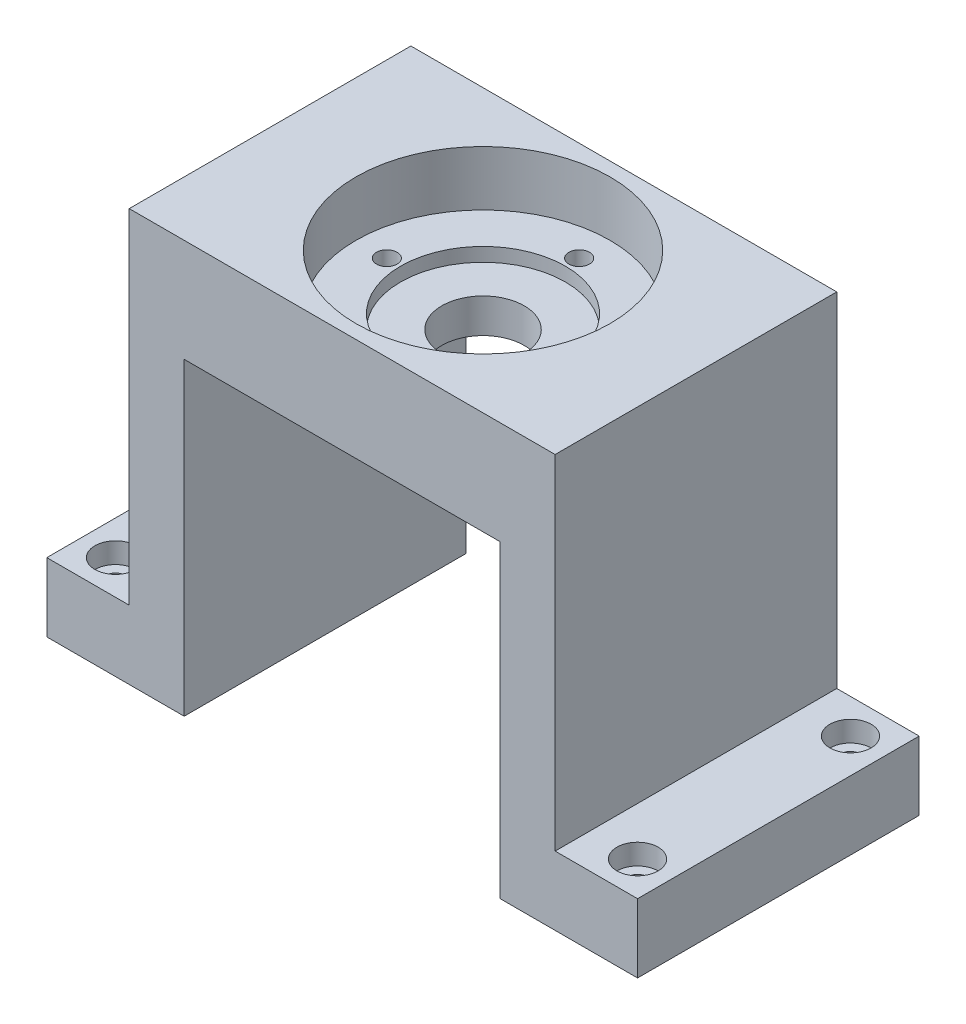
ISO-10303-21;
HEADER;
FILE_DESCRIPTION(('STEP AP214'),'2;1');
FILE_NAME('part.step','',(''),(''),'','','');
FILE_SCHEMA(('AUTOMOTIVE_DESIGN { 1 0 10303 214 1 1 1 1 }'));
ENDSEC;
DATA;
#1=APPLICATION_CONTEXT('core data for automotive mechanical design processes');
#2=APPLICATION_PROTOCOL_DEFINITION('international standard','automotive_design',2000,#1);
#3=PRODUCT_CONTEXT('',#1,'mechanical');
#4=PRODUCT('Part','Part','',(#3));
#5=PRODUCT_RELATED_PRODUCT_CATEGORY('part','',(#4));
#6=PRODUCT_DEFINITION_FORMATION('','',#4);
#7=PRODUCT_DEFINITION_CONTEXT('part definition',#1,'design');
#8=PRODUCT_DEFINITION('design','',#6,#7);
#9=PRODUCT_DEFINITION_SHAPE('','',#8);
#10=(LENGTH_UNIT() NAMED_UNIT(*) SI_UNIT(.MILLI.,.METRE.));
#11=(NAMED_UNIT(*) PLANE_ANGLE_UNIT() SI_UNIT($,.RADIAN.));
#12=(NAMED_UNIT(*) SI_UNIT($,.STERADIAN.) SOLID_ANGLE_UNIT());
#13=UNCERTAINTY_MEASURE_WITH_UNIT(LENGTH_MEASURE(1.E-05),#10,'distance_accuracy_value','');
#14=(GEOMETRIC_REPRESENTATION_CONTEXT(3) GLOBAL_UNCERTAINTY_ASSIGNED_CONTEXT((#13)) GLOBAL_UNIT_ASSIGNED_CONTEXT((#10,
#11,#12)) REPRESENTATION_CONTEXT('',''));
#15=CARTESIAN_POINT('',(0.,0.,0.));
#16=DIRECTION('',(0.,0.,1.));
#17=DIRECTION('',(1.,0.,0.));
#18=AXIS2_PLACEMENT_3D('',#15,#16,#17);
#19=CARTESIAN_POINT('',(0.,-0.001000000000001,14.));
#20=DIRECTION('',(0.,1.,0.));
#21=DIRECTION('',(0.,0.,1.));
#22=AXIS2_PLACEMENT_3D('',#19,#20,#21);
#23=CYLINDRICAL_SURFACE('',#22,1.5);
#24=CARTESIAN_POINT('',(0.,48.,14.));
#25=DIRECTION('',(0.,-1.,0.));
#26=DIRECTION('',(0.,0.,-1.));
#27=AXIS2_PLACEMENT_3D('',#24,#25,#26);
#28=CIRCLE('',#27,1.5);
#29=CARTESIAN_POINT('',(0.,48.,12.5));
#30=VERTEX_POINT('',#29);
#31=EDGE_CURVE('E149',#30,#30,#28,.F.);
#32=ORIENTED_EDGE('',*,*,#31,.F.);
#33=EDGE_LOOP('',(#32));
#34=FACE_BOUND('',#33,.T.);
#35=CARTESIAN_POINT('',(0.,52.,14.));
#36=DIRECTION('',(0.,1.,0.));
#37=DIRECTION('',(0.,0.,1.));
#38=AXIS2_PLACEMENT_3D('',#35,#36,#37);
#39=CIRCLE('',#38,1.5);
#40=CARTESIAN_POINT('',(0.,52.,15.5));
#41=VERTEX_POINT('',#40);
#42=EDGE_CURVE('E681',#41,#41,#39,.F.);
#43=ORIENTED_EDGE('',*,*,#42,.F.);
#44=EDGE_LOOP('',(#43));
#45=FACE_BOUND('',#44,.T.);
#46=ADVANCED_FACE('F38',(#34,#45),#23,.F.);
#47=CARTESIAN_POINT('',(14.,-0.001000000000001,0.));
#48=DIRECTION('',(0.,1.,0.));
#49=DIRECTION('',(0.,0.,1.));
#50=AXIS2_PLACEMENT_3D('',#47,#48,#49);
#51=CYLINDRICAL_SURFACE('',#50,1.5);
#52=CARTESIAN_POINT('',(14.,48.,0.));
#53=DIRECTION('',(0.,-1.,0.));
#54=DIRECTION('',(0.,0.,-1.));
#55=AXIS2_PLACEMENT_3D('',#52,#53,#54);
#56=CIRCLE('',#55,1.5);
#57=CARTESIAN_POINT('',(14.,48.,-1.5));
#58=VERTEX_POINT('',#57);
#59=EDGE_CURVE('E146',#58,#58,#56,.F.);
#60=ORIENTED_EDGE('',*,*,#59,.F.);
#61=EDGE_LOOP('',(#60));
#62=FACE_BOUND('',#61,.T.);
#63=CARTESIAN_POINT('',(14.,52.,0.));
#64=DIRECTION('',(0.,1.,0.));
#65=DIRECTION('',(0.,0.,1.));
#66=AXIS2_PLACEMENT_3D('',#63,#64,#65);
#67=CIRCLE('',#66,1.5);
#68=CARTESIAN_POINT('',(14.,52.,1.5));
#69=VERTEX_POINT('',#68);
#70=EDGE_CURVE('E685',#69,#69,#67,.F.);
#71=ORIENTED_EDGE('',*,*,#70,.F.);
#72=EDGE_LOOP('',(#71));
#73=FACE_BOUND('',#72,.T.);
#74=ADVANCED_FACE('F403',(#62,#73),#51,.F.);
#75=CARTESIAN_POINT('',(0.,-0.001000000000001,-14.));
#76=DIRECTION('',(0.,1.,0.));
#77=DIRECTION('',(0.,0.,1.));
#78=AXIS2_PLACEMENT_3D('',#75,#76,#77);
#79=CYLINDRICAL_SURFACE('',#78,1.5);
#80=CARTESIAN_POINT('',(0.,48.,-14.));
#81=DIRECTION('',(0.,-1.,0.));
#82=DIRECTION('',(0.,0.,-1.));
#83=AXIS2_PLACEMENT_3D('',#80,#81,#82);
#84=CIRCLE('',#83,1.5);
#85=CARTESIAN_POINT('',(0.,48.,-15.5));
#86=VERTEX_POINT('',#85);
#87=EDGE_CURVE('E141',#86,#86,#84,.F.);
#88=ORIENTED_EDGE('',*,*,#87,.F.);
#89=EDGE_LOOP('',(#88));
#90=FACE_BOUND('',#89,.T.);
#91=CARTESIAN_POINT('',(0.,52.,-14.));
#92=DIRECTION('',(0.,1.,0.));
#93=DIRECTION('',(0.,0.,1.));
#94=AXIS2_PLACEMENT_3D('',#91,#92,#93);
#95=CIRCLE('',#94,1.5);
#96=CARTESIAN_POINT('',(0.,52.,-12.5));
#97=VERTEX_POINT('',#96);
#98=EDGE_CURVE('E689',#97,#97,#95,.F.);
#99=ORIENTED_EDGE('',*,*,#98,.F.);
#100=EDGE_LOOP('',(#99));
#101=FACE_BOUND('',#100,.T.);
#102=ADVANCED_FACE('F409',(#90,#101),#79,.F.);
#103=CARTESIAN_POINT('',(-14.,-0.001000000000001,0.));
#104=DIRECTION('',(0.,1.,0.));
#105=DIRECTION('',(0.,0.,1.));
#106=AXIS2_PLACEMENT_3D('',#103,#104,#105);
#107=CYLINDRICAL_SURFACE('',#106,1.5);
#108=CARTESIAN_POINT('',(-14.,48.,0.));
#109=DIRECTION('',(0.,-1.,0.));
#110=DIRECTION('',(0.,0.,-1.));
#111=AXIS2_PLACEMENT_3D('',#108,#109,#110);
#112=CIRCLE('',#111,1.5);
#113=CARTESIAN_POINT('',(-14.,48.,-1.5));
#114=VERTEX_POINT('',#113);
#115=EDGE_CURVE('E137',#114,#114,#112,.F.);
#116=ORIENTED_EDGE('',*,*,#115,.F.);
#117=EDGE_LOOP('',(#116));
#118=FACE_BOUND('',#117,.T.);
#119=CARTESIAN_POINT('',(-14.,52.,0.));
#120=DIRECTION('',(0.,1.,0.));
#121=DIRECTION('',(0.,0.,1.));
#122=AXIS2_PLACEMENT_3D('',#119,#120,#121);
#123=CIRCLE('',#122,1.5);
#124=CARTESIAN_POINT('',(-14.,52.,1.5));
#125=VERTEX_POINT('',#124);
#126=EDGE_CURVE('E693',#125,#125,#123,.F.);
#127=ORIENTED_EDGE('',*,*,#126,.F.);
#128=EDGE_LOOP('',(#127));
#129=FACE_BOUND('',#128,.T.);
#130=ADVANCED_FACE('F563',(#118,#129),#107,.F.);
#131=CARTESIAN_POINT('',(0.,50.,0.));
#132=DIRECTION('',(0.,1.,0.));
#133=DIRECTION('',(0.,0.,1.));
#134=AXIS2_PLACEMENT_3D('',#131,#132,#133);
#135=CYLINDRICAL_SURFACE('',#134,12.);
#136=CARTESIAN_POINT('',(0.,50.,0.));
#137=DIRECTION('',(0.,1.,0.));
#138=DIRECTION('',(0.,0.,1.));
#139=AXIS2_PLACEMENT_3D('',#136,#137,#138);
#140=CIRCLE('',#139,12.);
#141=CARTESIAN_POINT('',(0.,50.,12.));
#142=VERTEX_POINT('',#141);
#143=EDGE_CURVE('E643',#142,#142,#140,.T.);
#144=ORIENTED_EDGE('',*,*,#143,.F.);
#145=EDGE_LOOP('',(#144));
#146=FACE_BOUND('',#145,.T.);
#147=CARTESIAN_POINT('',(0.,52.,0.));
#148=DIRECTION('',(0.,1.,0.));
#149=DIRECTION('',(0.,0.,1.));
#150=AXIS2_PLACEMENT_3D('',#147,#148,#149);
#151=CIRCLE('',#150,12.);
#152=CARTESIAN_POINT('',(0.,52.,12.));
#153=VERTEX_POINT('',#152);
#154=EDGE_CURVE('E42',#153,#153,#151,.F.);
#155=ORIENTED_EDGE('',*,*,#154,.F.);
#156=EDGE_LOOP('',(#155));
#157=FACE_BOUND('',#156,.T.);
#158=ADVANCED_FACE('F452',(#146,#157),#135,.F.);
#159=CARTESIAN_POINT('',(0.,45.,0.));
#160=DIRECTION('',(0.,1.,0.));
#161=DIRECTION('',(0.,0.,1.));
#162=AXIS2_PLACEMENT_3D('',#159,#160,#161);
#163=PLANE('',#162);
#164=CARTESIAN_POINT('',(0.,45.,0.));
#165=DIRECTION('',(0.,1.,0.));
#166=DIRECTION('',(0.,0.,1.));
#167=AXIS2_PLACEMENT_3D('',#164,#165,#166);
#168=CIRCLE('',#167,6.);
#169=CARTESIAN_POINT('',(0.,45.,6.));
#170=VERTEX_POINT('',#169);
#171=EDGE_CURVE('E649',#170,#170,#168,.F.);
#172=ORIENTED_EDGE('',*,*,#171,.F.);
#173=EDGE_LOOP('',(#172));
#174=FACE_BOUND('',#173,.T.);
#175=CARTESIAN_POINT('',(0.,45.,14.));
#176=DIRECTION('',(0.,-1.,0.));
#177=DIRECTION('',(0.,0.,-1.));
#178=AXIS2_PLACEMENT_3D('',#175,#176,#177);
#179=CIRCLE('',#178,3.);
#180=CARTESIAN_POINT('',(0.,45.,11.));
#181=VERTEX_POINT('',#180);
#182=EDGE_CURVE('E667',#181,#181,#179,.T.);
#183=ORIENTED_EDGE('',*,*,#182,.F.);
#184=EDGE_LOOP('',(#183));
#185=FACE_BOUND('',#184,.T.);
#186=CARTESIAN_POINT('',(14.,45.,0.));
#187=DIRECTION('',(0.,-1.,0.));
#188=DIRECTION('',(0.,0.,-1.));
#189=AXIS2_PLACEMENT_3D('',#186,#187,#188);
#190=CIRCLE('',#189,3.);
#191=CARTESIAN_POINT('',(14.,45.,-3.));
#192=VERTEX_POINT('',#191);
#193=EDGE_CURVE('E659',#192,#192,#190,.T.);
#194=ORIENTED_EDGE('',*,*,#193,.F.);
#195=EDGE_LOOP('',(#194));
#196=FACE_BOUND('',#195,.T.);
#197=CARTESIAN_POINT('',(0.,45.,-14.));
#198=DIRECTION('',(0.,-1.,0.));
#199=DIRECTION('',(0.,0.,-1.));
#200=AXIS2_PLACEMENT_3D('',#197,#198,#199);
#201=CIRCLE('',#200,3.);
#202=CARTESIAN_POINT('',(0.,45.,-17.));
#203=VERTEX_POINT('',#202);
#204=EDGE_CURVE('E646',#203,#203,#201,.T.);
#205=ORIENTED_EDGE('',*,*,#204,.F.);
#206=EDGE_LOOP('',(#205));
#207=FACE_BOUND('',#206,.T.);
#208=CARTESIAN_POINT('',(-14.,45.,0.));
#209=DIRECTION('',(0.,-1.,0.));
#210=DIRECTION('',(0.,0.,-1.));
#211=AXIS2_PLACEMENT_3D('',#208,#209,#210);
#212=CIRCLE('',#211,3.);
#213=CARTESIAN_POINT('',(-14.,45.,-3.));
#214=VERTEX_POINT('',#213);
#215=EDGE_CURVE('E640',#214,#214,#212,.T.);
#216=ORIENTED_EDGE('',*,*,#215,.F.);
#217=EDGE_LOOP('',(#216));
#218=FACE_BOUND('',#217,.T.);
#219=DIRECTION('',(0.,0.,1.));
#220=VECTOR('',#219,1.);
#221=CARTESIAN_POINT('',(23.,45.,-20.5));
#222=LINE('',#221,#220);
#223=CARTESIAN_POINT('',(23.,45.,-20.5));
#224=VERTEX_POINT('',#223);
#225=CARTESIAN_POINT('',(23.,45.,20.5));
#226=VERTEX_POINT('',#225);
#227=EDGE_CURVE('E157',#224,#226,#222,.T.);
#228=ORIENTED_EDGE('',*,*,#227,.T.);
#229=DIRECTION('',(1.,0.,0.));
#230=VECTOR('',#229,1.);
#231=CARTESIAN_POINT('',(-31.,45.,20.5));
#232=LINE('',#231,#230);
#233=CARTESIAN_POINT('',(-23.,45.,20.5));
#234=VERTEX_POINT('',#233);
#235=EDGE_CURVE('E239',#234,#226,#232,.T.);
#236=ORIENTED_EDGE('',*,*,#235,.F.);
#237=DIRECTION('',(0.,0.,-1.));
#238=VECTOR('',#237,1.);
#239=CARTESIAN_POINT('',(-23.,45.,-20.5));
#240=LINE('',#239,#238);
#241=CARTESIAN_POINT('',(-23.,45.,-20.5));
#242=VERTEX_POINT('',#241);
#243=EDGE_CURVE('E102',#234,#242,#240,.T.);
#244=ORIENTED_EDGE('',*,*,#243,.T.);
#245=DIRECTION('',(-1.,0.,0.));
#246=VECTOR('',#245,1.);
#247=CARTESIAN_POINT('',(-31.,45.,-20.5));
#248=LINE('',#247,#246);
#249=EDGE_CURVE('E251',#224,#242,#248,.T.);
#250=ORIENTED_EDGE('',*,*,#249,.F.);
#251=EDGE_LOOP('',(#228,#236,#244,#250));
#252=FACE_BOUND('',#251,.T.);
#253=ADVANCED_FACE('F364',(#174,#185,#196,#207,#218,#252),#163,.F.);
#254=CARTESIAN_POINT('',(-38.,-0.000999999999999265,15.5));
#255=DIRECTION('',(0.,1.,0.));
#256=DIRECTION('',(0.,0.,1.));
#257=AXIS2_PLACEMENT_3D('',#254,#255,#256);
#258=CYLINDRICAL_SURFACE('',#257,1.5);
#259=CARTESIAN_POINT('',(-38.,0.,15.5));
#260=DIRECTION('',(0.,1.,0.));
#261=DIRECTION('',(0.,0.,1.));
#262=AXIS2_PLACEMENT_3D('',#259,#260,#261);
#263=CIRCLE('',#262,1.5);
#264=CARTESIAN_POINT('',(-38.,0.,17.));
#265=VERTEX_POINT('',#264);
#266=EDGE_CURVE('E116',#265,#265,#263,.F.);
#267=ORIENTED_EDGE('',*,*,#266,.T.);
#268=EDGE_LOOP('',(#267));
#269=FACE_BOUND('',#268,.T.);
#270=CARTESIAN_POINT('',(-38.,7.,15.5));
#271=DIRECTION('',(0.,1.,0.));
#272=DIRECTION('',(0.,0.,1.));
#273=AXIS2_PLACEMENT_3D('',#270,#271,#272);
#274=CIRCLE('',#273,1.5);
#275=CARTESIAN_POINT('',(-38.,7.,17.));
#276=VERTEX_POINT('',#275);
#277=EDGE_CURVE('E132',#276,#276,#274,.F.);
#278=ORIENTED_EDGE('',*,*,#277,.F.);
#279=EDGE_LOOP('',(#278));
#280=FACE_BOUND('',#279,.T.);
#281=ADVANCED_FACE('F451',(#269,#280),#258,.F.);
#282=CARTESIAN_POINT('',(-38.,-0.000999999999999265,-15.5));
#283=DIRECTION('',(0.,1.,0.));
#284=DIRECTION('',(0.,0.,1.));
#285=AXIS2_PLACEMENT_3D('',#282,#283,#284);
#286=CYLINDRICAL_SURFACE('',#285,1.5);
#287=CARTESIAN_POINT('',(-38.,0.,-15.5));
#288=DIRECTION('',(0.,1.,0.));
#289=DIRECTION('',(0.,0.,1.));
#290=AXIS2_PLACEMENT_3D('',#287,#288,#289);
#291=CIRCLE('',#290,1.5);
#292=CARTESIAN_POINT('',(-38.,0.,-14.));
#293=VERTEX_POINT('',#292);
#294=EDGE_CURVE('E110',#293,#293,#291,.F.);
#295=ORIENTED_EDGE('',*,*,#294,.T.);
#296=EDGE_LOOP('',(#295));
#297=FACE_BOUND('',#296,.T.);
#298=CARTESIAN_POINT('',(-38.,7.,-15.5));
#299=DIRECTION('',(0.,1.,0.));
#300=DIRECTION('',(0.,0.,1.));
#301=AXIS2_PLACEMENT_3D('',#298,#299,#300);
#302=CIRCLE('',#301,1.5);
#303=CARTESIAN_POINT('',(-38.,7.,-14.));
#304=VERTEX_POINT('',#303);
#305=EDGE_CURVE('E128',#304,#304,#302,.F.);
#306=ORIENTED_EDGE('',*,*,#305,.F.);
#307=EDGE_LOOP('',(#306));
#308=FACE_BOUND('',#307,.T.);
#309=ADVANCED_FACE('F474',(#297,#308),#286,.F.);
#310=CARTESIAN_POINT('',(-23.,10.,-20.5));
#311=DIRECTION('',(-1.,0.,0.));
#312=DIRECTION('',(0.,0.,1.));
#313=AXIS2_PLACEMENT_3D('',#310,#311,#312);
#314=PLANE('',#313);
#315=DIRECTION('',(0.,0.,-1.));
#316=VECTOR('',#315,1.);
#317=CARTESIAN_POINT('',(-23.,0.,-20.5));
#318=LINE('',#317,#316);
#319=CARTESIAN_POINT('',(-23.,0.,20.5));
#320=VERTEX_POINT('',#319);
#321=CARTESIAN_POINT('',(-23.,0.,-20.5));
#322=VERTEX_POINT('',#321);
#323=EDGE_CURVE('E100',#320,#322,#318,.T.);
#324=ORIENTED_EDGE('',*,*,#323,.T.);
#325=DIRECTION('',(0.,-1.,0.));
#326=VECTOR('',#325,1.);
#327=CARTESIAN_POINT('',(-23.,10.,-20.5));
#328=LINE('',#327,#326);
#329=EDGE_CURVE('E11',#242,#322,#328,.T.);
#330=ORIENTED_EDGE('',*,*,#329,.F.);
#331=ORIENTED_EDGE('',*,*,#243,.F.);
#332=DIRECTION('',(0.,-1.,0.));
#333=VECTOR('',#332,1.);
#334=CARTESIAN_POINT('',(-23.,10.,20.5));
#335=LINE('',#334,#333);
#336=EDGE_CURVE('E86',#234,#320,#335,.T.);
#337=ORIENTED_EDGE('',*,*,#336,.T.);
#338=EDGE_LOOP('',(#324,#330,#331,#337));
#339=FACE_BOUND('',#338,.T.);
#340=ADVANCED_FACE('F40',(#339),#314,.F.);
#341=CARTESIAN_POINT('',(-43.,10.,-20.5));
#342=DIRECTION('',(0.,0.,1.));
#343=DIRECTION('',(1.,0.,0.));
#344=AXIS2_PLACEMENT_3D('',#341,#342,#343);
#345=PLANE('',#344);
#346=DIRECTION('',(-1.,0.,0.));
#347=VECTOR('',#346,1.);
#348=CARTESIAN_POINT('',(-43.,0.,-20.5));
#349=LINE('',#348,#347);
#350=CARTESIAN_POINT('',(-43.,0.,-20.5));
#351=VERTEX_POINT('',#350);
#352=EDGE_CURVE('E108',#322,#351,#349,.T.);
#353=ORIENTED_EDGE('',*,*,#352,.T.);
#354=DIRECTION('',(0.,-1.,0.));
#355=VECTOR('',#354,1.);
#356=CARTESIAN_POINT('',(-43.,10.,-20.5));
#357=LINE('',#356,#355);
#358=CARTESIAN_POINT('',(-43.,10.,-20.5));
#359=VERTEX_POINT('',#358);
#360=EDGE_CURVE('E48',#359,#351,#357,.T.);
#361=ORIENTED_EDGE('',*,*,#360,.F.);
#362=DIRECTION('',(-1.,0.,0.));
#363=VECTOR('',#362,1.);
#364=CARTESIAN_POINT('',(-43.,10.,-20.5));
#365=LINE('',#364,#363);
#366=CARTESIAN_POINT('',(-31.,10.,-20.5));
#367=VERTEX_POINT('',#366);
#368=EDGE_CURVE('E94',#367,#359,#365,.T.);
#369=ORIENTED_EDGE('',*,*,#368,.F.);
#370=DIRECTION('',(0.,-1.,0.));
#371=VECTOR('',#370,1.);
#372=CARTESIAN_POINT('',(-31.,45.,-20.5));
#373=LINE('',#372,#371);
#374=CARTESIAN_POINT('',(-31.,60.,-20.5));
#375=VERTEX_POINT('',#374);
#376=EDGE_CURVE('E283',#375,#367,#373,.T.);
#377=ORIENTED_EDGE('',*,*,#376,.F.);
#378=DIRECTION('',(-1.,0.,0.));
#379=VECTOR('',#378,1.);
#380=CARTESIAN_POINT('',(-31.,60.,-20.5));
#381=LINE('',#380,#379);
#382=CARTESIAN_POINT('',(31.,60.,-20.5));
#383=VERTEX_POINT('',#382);
#384=EDGE_CURVE('E259',#383,#375,#381,.T.);
#385=ORIENTED_EDGE('',*,*,#384,.F.);
#386=DIRECTION('',(0.,-1.,0.));
#387=VECTOR('',#386,1.);
#388=CARTESIAN_POINT('',(31.,60.,-20.5));
#389=LINE('',#388,#387);
#390=CARTESIAN_POINT('',(31.,10.,-20.5));
#391=VERTEX_POINT('',#390);
#392=EDGE_CURVE('E263',#383,#391,#389,.T.);
#393=ORIENTED_EDGE('',*,*,#392,.T.);
#394=DIRECTION('',(-1.,0.,0.));
#395=VECTOR('',#394,1.);
#396=CARTESIAN_POINT('',(43.,10.,-20.5));
#397=LINE('',#396,#395);
#398=CARTESIAN_POINT('',(43.,10.,-20.5));
#399=VERTEX_POINT('',#398);
#400=EDGE_CURVE('E196',#399,#391,#397,.T.);
#401=ORIENTED_EDGE('',*,*,#400,.F.);
#402=DIRECTION('',(0.,-1.,0.));
#403=VECTOR('',#402,1.);
#404=CARTESIAN_POINT('',(43.,10.,-20.5));
#405=LINE('',#404,#403);
#406=CARTESIAN_POINT('',(43.,0.,-20.5));
#407=VERTEX_POINT('',#406);
#408=EDGE_CURVE('E209',#399,#407,#405,.T.);
#409=ORIENTED_EDGE('',*,*,#408,.T.);
#410=DIRECTION('',(-1.,0.,0.));
#411=VECTOR('',#410,1.);
#412=CARTESIAN_POINT('',(43.,0.,-20.5));
#413=LINE('',#412,#411);
#414=CARTESIAN_POINT('',(23.,0.,-20.5));
#415=VERTEX_POINT('',#414);
#416=EDGE_CURVE('E190',#407,#415,#413,.T.);
#417=ORIENTED_EDGE('',*,*,#416,.T.);
#418=DIRECTION('',(0.,-1.,0.));
#419=VECTOR('',#418,1.);
#420=CARTESIAN_POINT('',(23.,10.,-20.5));
#421=LINE('',#420,#419);
#422=EDGE_CURVE('E235',#224,#415,#421,.T.);
#423=ORIENTED_EDGE('',*,*,#422,.F.);
#424=ORIENTED_EDGE('',*,*,#249,.T.);
#425=ORIENTED_EDGE('',*,*,#329,.T.);
#426=EDGE_LOOP('',(#353,#361,#369,#377,#385,#393,#401,#409,#417,#423,#424,#425));
#427=FACE_BOUND('',#426,.T.);
#428=ADVANCED_FACE('F358',(#427),#345,.F.);
#429=CARTESIAN_POINT('',(-43.,10.,-20.5));
#430=DIRECTION('',(1.,0.,0.));
#431=DIRECTION('',(0.,0.,-1.));
#432=AXIS2_PLACEMENT_3D('',#429,#430,#431);
#433=PLANE('',#432);
#434=DIRECTION('',(0.,0.,1.));
#435=VECTOR('',#434,1.);
#436=CARTESIAN_POINT('',(-43.,0.,-20.5));
#437=LINE('',#436,#435);
#438=CARTESIAN_POINT('',(-43.,0.,20.5));
#439=VERTEX_POINT('',#438);
#440=EDGE_CURVE('E95',#351,#439,#437,.T.);
#441=ORIENTED_EDGE('',*,*,#440,.T.);
#442=DIRECTION('',(0.,-1.,0.));
#443=VECTOR('',#442,1.);
#444=CARTESIAN_POINT('',(-43.,10.,20.5));
#445=LINE('',#444,#443);
#446=CARTESIAN_POINT('',(-43.,10.,20.5));
#447=VERTEX_POINT('',#446);
#448=EDGE_CURVE('E89',#447,#439,#445,.T.);
#449=ORIENTED_EDGE('',*,*,#448,.F.);
#450=DIRECTION('',(0.,0.,1.));
#451=VECTOR('',#450,1.);
#452=CARTESIAN_POINT('',(-43.,10.,-20.5));
#453=LINE('',#452,#451);
#454=EDGE_CURVE('E62',#359,#447,#453,.T.);
#455=ORIENTED_EDGE('',*,*,#454,.F.);
#456=ORIENTED_EDGE('',*,*,#360,.T.);
#457=EDGE_LOOP('',(#441,#449,#455,#456));
#458=FACE_BOUND('',#457,.T.);
#459=ADVANCED_FACE('F488',(#458),#433,.F.);
#460=CARTESIAN_POINT('',(-43.,10.,20.5));
#461=DIRECTION('',(0.,0.,-1.));
#462=DIRECTION('',(-1.,0.,0.));
#463=AXIS2_PLACEMENT_3D('',#460,#461,#462);
#464=PLANE('',#463);
#465=DIRECTION('',(1.,0.,0.));
#466=VECTOR('',#465,1.);
#467=CARTESIAN_POINT('',(-43.,0.,20.5));
#468=LINE('',#467,#466);
#469=EDGE_CURVE('E82',#439,#320,#468,.T.);
#470=ORIENTED_EDGE('',*,*,#469,.T.);
#471=ORIENTED_EDGE('',*,*,#336,.F.);
#472=ORIENTED_EDGE('',*,*,#235,.T.);
#473=DIRECTION('',(0.,-1.,0.));
#474=VECTOR('',#473,1.);
#475=CARTESIAN_POINT('',(23.,10.,20.5));
#476=LINE('',#475,#474);
#477=CARTESIAN_POINT('',(23.,0.,20.5));
#478=VERTEX_POINT('',#477);
#479=EDGE_CURVE('E231',#226,#478,#476,.T.);
#480=ORIENTED_EDGE('',*,*,#479,.T.);
#481=DIRECTION('',(1.,0.,0.));
#482=VECTOR('',#481,1.);
#483=CARTESIAN_POINT('',(43.,0.,20.5));
#484=LINE('',#483,#482);
#485=CARTESIAN_POINT('',(43.,0.,20.5));
#486=VERTEX_POINT('',#485);
#487=EDGE_CURVE('E217',#478,#486,#484,.T.);
#488=ORIENTED_EDGE('',*,*,#487,.T.);
#489=DIRECTION('',(0.,-1.,0.));
#490=VECTOR('',#489,1.);
#491=CARTESIAN_POINT('',(43.,10.,20.5));
#492=LINE('',#491,#490);
#493=CARTESIAN_POINT('',(43.,10.,20.5));
#494=VERTEX_POINT('',#493);
#495=EDGE_CURVE('E227',#494,#486,#492,.T.);
#496=ORIENTED_EDGE('',*,*,#495,.F.);
#497=DIRECTION('',(1.,0.,0.));
#498=VECTOR('',#497,1.);
#499=CARTESIAN_POINT('',(43.,10.,20.5));
#500=LINE('',#499,#498);
#501=CARTESIAN_POINT('',(31.,10.,20.5));
#502=VERTEX_POINT('',#501);
#503=EDGE_CURVE('E200',#502,#494,#500,.T.);
#504=ORIENTED_EDGE('',*,*,#503,.F.);
#505=DIRECTION('',(0.,-1.,0.));
#506=VECTOR('',#505,1.);
#507=CARTESIAN_POINT('',(31.,60.,20.5));
#508=LINE('',#507,#506);
#509=CARTESIAN_POINT('',(31.,60.,20.5));
#510=VERTEX_POINT('',#509);
#511=EDGE_CURVE('E272',#510,#502,#508,.T.);
#512=ORIENTED_EDGE('',*,*,#511,.F.);
#513=DIRECTION('',(1.,0.,0.));
#514=VECTOR('',#513,1.);
#515=CARTESIAN_POINT('',(-31.,60.,20.5));
#516=LINE('',#515,#514);
#517=CARTESIAN_POINT('',(-31.,60.,20.5));
#518=VERTEX_POINT('',#517);
#519=EDGE_CURVE('E250',#518,#510,#516,.T.);
#520=ORIENTED_EDGE('',*,*,#519,.F.);
#521=DIRECTION('',(0.,-1.,0.));
#522=VECTOR('',#521,1.);
#523=CARTESIAN_POINT('',(-31.,45.,20.5));
#524=LINE('',#523,#522);
#525=CARTESIAN_POINT('',(-31.,10.,20.5));
#526=VERTEX_POINT('',#525);
#527=EDGE_CURVE('E277',#518,#526,#524,.T.);
#528=ORIENTED_EDGE('',*,*,#527,.T.);
#529=DIRECTION('',(1.,0.,0.));
#530=VECTOR('',#529,1.);
#531=CARTESIAN_POINT('',(-43.,10.,20.5));
#532=LINE('',#531,#530);
#533=EDGE_CURVE('E105',#447,#526,#532,.T.);
#534=ORIENTED_EDGE('',*,*,#533,.F.);
#535=ORIENTED_EDGE('',*,*,#448,.T.);
#536=EDGE_LOOP('',(#470,#471,#472,#480,#488,#496,#504,#512,#520,#528,#534,#535));
#537=FACE_BOUND('',#536,.T.);
#538=ADVANCED_FACE('F84',(#537),#464,.F.);
#539=CARTESIAN_POINT('',(0.,10.,0.));
#540=DIRECTION('',(0.,1.,0.));
#541=DIRECTION('',(0.,0.,1.));
#542=AXIS2_PLACEMENT_3D('',#539,#540,#541);
#543=PLANE('',#542);
#544=DIRECTION('',(0.,0.,1.));
#545=VECTOR('',#544,1.);
#546=CARTESIAN_POINT('',(-31.,10.,-20.5));
#547=LINE('',#546,#545);
#548=EDGE_CURVE('E56',#367,#526,#547,.T.);
#549=ORIENTED_EDGE('',*,*,#548,.F.);
#550=ORIENTED_EDGE('',*,*,#368,.T.);
#551=ORIENTED_EDGE('',*,*,#454,.T.);
#552=ORIENTED_EDGE('',*,*,#533,.T.);
#553=EDGE_LOOP('',(#549,#550,#551,#552));
#554=FACE_BOUND('',#553,.T.);
#555=CARTESIAN_POINT('',(-38.,10.,-15.5));
#556=DIRECTION('',(0.,1.,0.));
#557=DIRECTION('',(0.,0.,1.));
#558=AXIS2_PLACEMENT_3D('',#555,#556,#557);
#559=CIRCLE('',#558,3.);
#560=CARTESIAN_POINT('',(-38.,10.,-12.5));
#561=VERTEX_POINT('',#560);
#562=EDGE_CURVE('E291',#561,#561,#559,.T.);
#563=ORIENTED_EDGE('',*,*,#562,.F.);
#564=EDGE_LOOP('',(#563));
#565=FACE_BOUND('',#564,.T.);
#566=CARTESIAN_POINT('',(-38.,10.,15.5));
#567=DIRECTION('',(0.,1.,0.));
#568=DIRECTION('',(0.,0.,1.));
#569=AXIS2_PLACEMENT_3D('',#566,#567,#568);
#570=CIRCLE('',#569,3.);
#571=CARTESIAN_POINT('',(-38.,10.,18.5));
#572=VERTEX_POINT('',#571);
#573=EDGE_CURVE('E287',#572,#572,#570,.T.);
#574=ORIENTED_EDGE('',*,*,#573,.F.);
#575=EDGE_LOOP('',(#574));
#576=FACE_BOUND('',#575,.T.);
#577=ADVANCED_FACE('F309',(#554,#565,#576),#543,.T.);
#578=CARTESIAN_POINT('',(0.,0.,0.));
#579=DIRECTION('',(0.,1.,0.));
#580=DIRECTION('',(0.,0.,1.));
#581=AXIS2_PLACEMENT_3D('',#578,#579,#580);
#582=PLANE('',#581);
#583=ORIENTED_EDGE('',*,*,#294,.F.);
#584=EDGE_LOOP('',(#583));
#585=FACE_BOUND('',#584,.T.);
#586=ORIENTED_EDGE('',*,*,#266,.F.);
#587=EDGE_LOOP('',(#586));
#588=FACE_BOUND('',#587,.T.);
#589=ORIENTED_EDGE('',*,*,#323,.F.);
#590=ORIENTED_EDGE('',*,*,#469,.F.);
#591=ORIENTED_EDGE('',*,*,#440,.F.);
#592=ORIENTED_EDGE('',*,*,#352,.F.);
#593=EDGE_LOOP('',(#589,#590,#591,#592));
#594=FACE_BOUND('',#593,.T.);
#595=ADVANCED_FACE('F107',(#585,#588,#594),#582,.F.);
#596=CARTESIAN_POINT('',(-38.,7.,-15.5));
#597=DIRECTION('',(0.,1.,0.));
#598=DIRECTION('',(0.,0.,1.));
#599=AXIS2_PLACEMENT_3D('',#596,#597,#598);
#600=PLANE('',#599);
#601=CARTESIAN_POINT('',(-38.,7.,-15.5));
#602=DIRECTION('',(0.,1.,0.));
#603=DIRECTION('',(0.,0.,1.));
#604=AXIS2_PLACEMENT_3D('',#601,#602,#603);
#605=CIRCLE('',#604,3.);
#606=CARTESIAN_POINT('',(-38.,7.,-12.5));
#607=VERTEX_POINT('',#606);
#608=EDGE_CURVE('E133',#607,#607,#605,.T.);
#609=ORIENTED_EDGE('',*,*,#608,.T.);
#610=EDGE_LOOP('',(#609));
#611=FACE_BOUND('',#610,.T.);
#612=ORIENTED_EDGE('',*,*,#305,.T.);
#613=EDGE_LOOP('',(#612));
#614=FACE_BOUND('',#613,.T.);
#615=ADVANCED_FACE('F459',(#611,#614),#600,.T.);
#616=CARTESIAN_POINT('',(-38.,7.,-15.5));
#617=DIRECTION('',(0.,1.,0.));
#618=DIRECTION('',(0.,0.,1.));
#619=AXIS2_PLACEMENT_3D('',#616,#617,#618);
#620=CYLINDRICAL_SURFACE('',#619,3.);
#621=ORIENTED_EDGE('',*,*,#608,.F.);
#622=EDGE_LOOP('',(#621));
#623=FACE_BOUND('',#622,.T.);
#624=ORIENTED_EDGE('',*,*,#562,.T.);
#625=EDGE_LOOP('',(#624));
#626=FACE_BOUND('',#625,.T.);
#627=ADVANCED_FACE('F462',(#623,#626),#620,.F.);
#628=CARTESIAN_POINT('',(-38.,7.,15.5));
#629=DIRECTION('',(0.,1.,0.));
#630=DIRECTION('',(0.,0.,1.));
#631=AXIS2_PLACEMENT_3D('',#628,#629,#630);
#632=PLANE('',#631);
#633=CARTESIAN_POINT('',(-38.,7.,15.5));
#634=DIRECTION('',(0.,1.,0.));
#635=DIRECTION('',(0.,0.,1.));
#636=AXIS2_PLACEMENT_3D('',#633,#634,#635);
#637=CIRCLE('',#636,3.);
#638=CARTESIAN_POINT('',(-38.,7.,18.5));
#639=VERTEX_POINT('',#638);
#640=EDGE_CURVE('E295',#639,#639,#637,.T.);
#641=ORIENTED_EDGE('',*,*,#640,.T.);
#642=EDGE_LOOP('',(#641));
#643=FACE_BOUND('',#642,.T.);
#644=ORIENTED_EDGE('',*,*,#277,.T.);
#645=EDGE_LOOP('',(#644));
#646=FACE_BOUND('',#645,.T.);
#647=ADVANCED_FACE('F466',(#643,#646),#632,.T.);
#648=CARTESIAN_POINT('',(-38.,7.,15.5));
#649=DIRECTION('',(0.,1.,0.));
#650=DIRECTION('',(0.,0.,1.));
#651=AXIS2_PLACEMENT_3D('',#648,#649,#650);
#652=CYLINDRICAL_SURFACE('',#651,3.);
#653=ORIENTED_EDGE('',*,*,#640,.F.);
#654=EDGE_LOOP('',(#653));
#655=FACE_BOUND('',#654,.T.);
#656=ORIENTED_EDGE('',*,*,#573,.T.);
#657=EDGE_LOOP('',(#656));
#658=FACE_BOUND('',#657,.T.);
#659=ADVANCED_FACE('F458',(#655,#658),#652,.F.);
#660=CARTESIAN_POINT('',(-31.,45.,-20.5));
#661=DIRECTION('',(1.,0.,0.));
#662=DIRECTION('',(0.,0.,-1.));
#663=AXIS2_PLACEMENT_3D('',#660,#661,#662);
#664=PLANE('',#663);
#665=ORIENTED_EDGE('',*,*,#548,.T.);
#666=ORIENTED_EDGE('',*,*,#527,.F.);
#667=DIRECTION('',(0.,0.,1.));
#668=VECTOR('',#667,1.);
#669=CARTESIAN_POINT('',(-31.,60.,-20.5));
#670=LINE('',#669,#668);
#671=EDGE_CURVE('E246',#375,#518,#670,.T.);
#672=ORIENTED_EDGE('',*,*,#671,.F.);
#673=ORIENTED_EDGE('',*,*,#376,.T.);
#674=EDGE_LOOP('',(#665,#666,#672,#673));
#675=FACE_BOUND('',#674,.T.);
#676=ADVANCED_FACE('F314',(#675),#664,.F.);
#677=CARTESIAN_POINT('',(31.,60.,-20.5));
#678=DIRECTION('',(-1.,0.,0.));
#679=DIRECTION('',(0.,0.,1.));
#680=AXIS2_PLACEMENT_3D('',#677,#678,#679);
#681=PLANE('',#680);
#682=ORIENTED_EDGE('',*,*,#511,.T.);
#683=DIRECTION('',(0.,0.,-1.));
#684=VECTOR('',#683,1.);
#685=CARTESIAN_POINT('',(31.,10.,-20.5));
#686=LINE('',#685,#684);
#687=EDGE_CURVE('E152',#502,#391,#686,.T.);
#688=ORIENTED_EDGE('',*,*,#687,.T.);
#689=ORIENTED_EDGE('',*,*,#392,.F.);
#690=DIRECTION('',(0.,0.,-1.));
#691=VECTOR('',#690,1.);
#692=CARTESIAN_POINT('',(31.,60.,-20.5));
#693=LINE('',#692,#691);
#694=EDGE_CURVE('E255',#510,#383,#693,.T.);
#695=ORIENTED_EDGE('',*,*,#694,.F.);
#696=EDGE_LOOP('',(#682,#688,#689,#695));
#697=FACE_BOUND('',#696,.T.);
#698=ADVANCED_FACE('F447',(#697),#681,.F.);
#699=CARTESIAN_POINT('',(0.,60.,0.));
#700=DIRECTION('',(0.,1.,0.));
#701=DIRECTION('',(0.,0.,1.));
#702=AXIS2_PLACEMENT_3D('',#699,#700,#701);
#703=PLANE('',#702);
#704=CARTESIAN_POINT('',(0.,60.,0.));
#705=DIRECTION('',(0.,1.,0.));
#706=DIRECTION('',(0.,0.,1.));
#707=AXIS2_PLACEMENT_3D('',#704,#705,#706);
#708=CIRCLE('',#707,18.5);
#709=CARTESIAN_POINT('',(0.,60.,18.5));
#710=VERTEX_POINT('',#709);
#711=EDGE_CURVE('E697',#710,#710,#708,.T.);
#712=ORIENTED_EDGE('',*,*,#711,.F.);
#713=EDGE_LOOP('',(#712));
#714=FACE_BOUND('',#713,.T.);
#715=ORIENTED_EDGE('',*,*,#671,.T.);
#716=ORIENTED_EDGE('',*,*,#519,.T.);
#717=ORIENTED_EDGE('',*,*,#694,.T.);
#718=ORIENTED_EDGE('',*,*,#384,.T.);
#719=EDGE_LOOP('',(#715,#716,#717,#718));
#720=FACE_BOUND('',#719,.T.);
#721=ADVANCED_FACE('F326',(#714,#720),#703,.T.);
#722=CARTESIAN_POINT('',(38.,-0.000999999999999265,-15.5));
#723=DIRECTION('',(0.,1.,0.));
#724=DIRECTION('',(0.,0.,1.));
#725=AXIS2_PLACEMENT_3D('',#722,#723,#724);
#726=CYLINDRICAL_SURFACE('',#725,1.5);
#727=CARTESIAN_POINT('',(38.,0.,-15.5));
#728=DIRECTION('',(0.,1.,0.));
#729=DIRECTION('',(0.,0.,1.));
#730=AXIS2_PLACEMENT_3D('',#727,#728,#729);
#731=CIRCLE('',#730,1.5);
#732=CARTESIAN_POINT('',(38.,0.,-14.));
#733=VERTEX_POINT('',#732);
#734=EDGE_CURVE('E191',#733,#733,#731,.F.);
#735=ORIENTED_EDGE('',*,*,#734,.T.);
#736=EDGE_LOOP('',(#735));
#737=FACE_BOUND('',#736,.T.);
#738=CARTESIAN_POINT('',(38.,7.,-15.5));
#739=DIRECTION('',(0.,1.,0.));
#740=DIRECTION('',(0.,0.,1.));
#741=AXIS2_PLACEMENT_3D('',#738,#739,#740);
#742=CIRCLE('',#741,1.5);
#743=CARTESIAN_POINT('',(38.,7.,-14.));
#744=VERTEX_POINT('',#743);
#745=EDGE_CURVE('E195',#744,#744,#742,.F.);
#746=ORIENTED_EDGE('',*,*,#745,.F.);
#747=EDGE_LOOP('',(#746));
#748=FACE_BOUND('',#747,.T.);
#749=ADVANCED_FACE('F430',(#737,#748),#726,.F.);
#750=CARTESIAN_POINT('',(38.,-0.000999999999999265,15.5));
#751=DIRECTION('',(0.,1.,0.));
#752=DIRECTION('',(0.,0.,1.));
#753=AXIS2_PLACEMENT_3D('',#750,#751,#752);
#754=CYLINDRICAL_SURFACE('',#753,1.5);
#755=CARTESIAN_POINT('',(38.,0.,15.5));
#756=DIRECTION('',(0.,1.,0.));
#757=DIRECTION('',(0.,0.,1.));
#758=AXIS2_PLACEMENT_3D('',#755,#756,#757);
#759=CIRCLE('',#758,1.5);
#760=CARTESIAN_POINT('',(38.,0.,17.));
#761=VERTEX_POINT('',#760);
#762=EDGE_CURVE('E186',#761,#761,#759,.F.);
#763=ORIENTED_EDGE('',*,*,#762,.T.);
#764=EDGE_LOOP('',(#763));
#765=FACE_BOUND('',#764,.T.);
#766=CARTESIAN_POINT('',(38.,7.,15.5));
#767=DIRECTION('',(0.,1.,0.));
#768=DIRECTION('',(0.,0.,1.));
#769=AXIS2_PLACEMENT_3D('',#766,#767,#768);
#770=CIRCLE('',#769,1.5);
#771=CARTESIAN_POINT('',(38.,7.,17.));
#772=VERTEX_POINT('',#771);
#773=EDGE_CURVE('E174',#772,#772,#770,.F.);
#774=ORIENTED_EDGE('',*,*,#773,.F.);
#775=EDGE_LOOP('',(#774));
#776=FACE_BOUND('',#775,.T.);
#777=ADVANCED_FACE('F428',(#765,#776),#754,.F.);
#778=CARTESIAN_POINT('',(23.,10.,-20.5));
#779=DIRECTION('',(1.,0.,0.));
#780=DIRECTION('',(0.,0.,-1.));
#781=AXIS2_PLACEMENT_3D('',#778,#779,#780);
#782=PLANE('',#781);
#783=DIRECTION('',(0.,0.,1.));
#784=VECTOR('',#783,1.);
#785=CARTESIAN_POINT('',(23.,0.,-20.5));
#786=LINE('',#785,#784);
#787=EDGE_CURVE('E213',#415,#478,#786,.T.);
#788=ORIENTED_EDGE('',*,*,#787,.T.);
#789=ORIENTED_EDGE('',*,*,#479,.F.);
#790=ORIENTED_EDGE('',*,*,#227,.F.);
#791=ORIENTED_EDGE('',*,*,#422,.T.);
#792=EDGE_LOOP('',(#788,#789,#790,#791));
#793=FACE_BOUND('',#792,.T.);
#794=ADVANCED_FACE('F362',(#793),#782,.F.);
#795=CARTESIAN_POINT('',(43.,10.,-20.5));
#796=DIRECTION('',(-1.,0.,0.));
#797=DIRECTION('',(0.,0.,1.));
#798=AXIS2_PLACEMENT_3D('',#795,#796,#797);
#799=PLANE('',#798);
#800=DIRECTION('',(0.,0.,-1.));
#801=VECTOR('',#800,1.);
#802=CARTESIAN_POINT('',(43.,0.,-20.5));
#803=LINE('',#802,#801);
#804=EDGE_CURVE('E201',#486,#407,#803,.T.);
#805=ORIENTED_EDGE('',*,*,#804,.T.);
#806=ORIENTED_EDGE('',*,*,#408,.F.);
#807=DIRECTION('',(0.,0.,-1.));
#808=VECTOR('',#807,1.);
#809=CARTESIAN_POINT('',(43.,10.,-20.5));
#810=LINE('',#809,#808);
#811=EDGE_CURVE('E205',#494,#399,#810,.T.);
#812=ORIENTED_EDGE('',*,*,#811,.F.);
#813=ORIENTED_EDGE('',*,*,#495,.T.);
#814=EDGE_LOOP('',(#805,#806,#812,#813));
#815=FACE_BOUND('',#814,.T.);
#816=ADVANCED_FACE('F372',(#815),#799,.F.);
#817=CARTESIAN_POINT('',(0.,10.,0.));
#818=DIRECTION('',(0.,1.,0.));
#819=DIRECTION('',(0.,0.,1.));
#820=AXIS2_PLACEMENT_3D('',#817,#818,#819);
#821=PLANE('',#820);
#822=ORIENTED_EDGE('',*,*,#687,.F.);
#823=ORIENTED_EDGE('',*,*,#503,.T.);
#824=ORIENTED_EDGE('',*,*,#811,.T.);
#825=ORIENTED_EDGE('',*,*,#400,.T.);
#826=EDGE_LOOP('',(#822,#823,#824,#825));
#827=FACE_BOUND('',#826,.T.);
#828=CARTESIAN_POINT('',(38.,10.,15.5));
#829=DIRECTION('',(0.,1.,0.));
#830=DIRECTION('',(0.,0.,1.));
#831=AXIS2_PLACEMENT_3D('',#828,#829,#830);
#832=CIRCLE('',#831,3.);
#833=CARTESIAN_POINT('',(38.,10.,18.5));
#834=VERTEX_POINT('',#833);
#835=EDGE_CURVE('E175',#834,#834,#832,.T.);
#836=ORIENTED_EDGE('',*,*,#835,.F.);
#837=EDGE_LOOP('',(#836));
#838=FACE_BOUND('',#837,.T.);
#839=CARTESIAN_POINT('',(38.,10.,-15.5));
#840=DIRECTION('',(0.,1.,0.));
#841=DIRECTION('',(0.,0.,1.));
#842=AXIS2_PLACEMENT_3D('',#839,#840,#841);
#843=CIRCLE('',#842,3.);
#844=CARTESIAN_POINT('',(38.,10.,-12.5));
#845=VERTEX_POINT('',#844);
#846=EDGE_CURVE('E166',#845,#845,#843,.T.);
#847=ORIENTED_EDGE('',*,*,#846,.F.);
#848=EDGE_LOOP('',(#847));
#849=FACE_BOUND('',#848,.T.);
#850=ADVANCED_FACE('F376',(#827,#838,#849),#821,.T.);
#851=CARTESIAN_POINT('',(0.,0.,0.));
#852=DIRECTION('',(0.,1.,0.));
#853=DIRECTION('',(0.,0.,1.));
#854=AXIS2_PLACEMENT_3D('',#851,#852,#853);
#855=PLANE('',#854);
#856=ORIENTED_EDGE('',*,*,#762,.F.);
#857=EDGE_LOOP('',(#856));
#858=FACE_BOUND('',#857,.T.);
#859=ORIENTED_EDGE('',*,*,#734,.F.);
#860=EDGE_LOOP('',(#859));
#861=FACE_BOUND('',#860,.T.);
#862=ORIENTED_EDGE('',*,*,#416,.F.);
#863=ORIENTED_EDGE('',*,*,#804,.F.);
#864=ORIENTED_EDGE('',*,*,#487,.F.);
#865=ORIENTED_EDGE('',*,*,#787,.F.);
#866=EDGE_LOOP('',(#862,#863,#864,#865));
#867=FACE_BOUND('',#866,.T.);
#868=ADVANCED_FACE('F369',(#858,#861,#867),#855,.F.);
#869=CARTESIAN_POINT('',(38.,7.,15.5));
#870=DIRECTION('',(0.,1.,0.));
#871=DIRECTION('',(0.,0.,1.));
#872=AXIS2_PLACEMENT_3D('',#869,#870,#871);
#873=PLANE('',#872);
#874=CARTESIAN_POINT('',(38.,7.,15.5));
#875=DIRECTION('',(0.,1.,0.));
#876=DIRECTION('',(0.,0.,1.));
#877=AXIS2_PLACEMENT_3D('',#874,#875,#876);
#878=CIRCLE('',#877,3.);
#879=CARTESIAN_POINT('',(38.,7.,18.5));
#880=VERTEX_POINT('',#879);
#881=EDGE_CURVE('E170',#880,#880,#878,.T.);
#882=ORIENTED_EDGE('',*,*,#881,.T.);
#883=EDGE_LOOP('',(#882));
#884=FACE_BOUND('',#883,.T.);
#885=ORIENTED_EDGE('',*,*,#773,.T.);
#886=EDGE_LOOP('',(#885));
#887=FACE_BOUND('',#886,.T.);
#888=ADVANCED_FACE('F415',(#884,#887),#873,.T.);
#889=CARTESIAN_POINT('',(38.,7.,15.5));
#890=DIRECTION('',(0.,1.,0.));
#891=DIRECTION('',(0.,0.,1.));
#892=AXIS2_PLACEMENT_3D('',#889,#890,#891);
#893=CYLINDRICAL_SURFACE('',#892,3.);
#894=ORIENTED_EDGE('',*,*,#881,.F.);
#895=EDGE_LOOP('',(#894));
#896=FACE_BOUND('',#895,.T.);
#897=ORIENTED_EDGE('',*,*,#835,.T.);
#898=EDGE_LOOP('',(#897));
#899=FACE_BOUND('',#898,.T.);
#900=ADVANCED_FACE('F398',(#896,#899),#893,.F.);
#901=CARTESIAN_POINT('',(38.,7.,-15.5));
#902=DIRECTION('',(0.,1.,0.));
#903=DIRECTION('',(0.,0.,1.));
#904=AXIS2_PLACEMENT_3D('',#901,#902,#903);
#905=PLANE('',#904);
#906=CARTESIAN_POINT('',(38.,7.,-15.5));
#907=DIRECTION('',(0.,1.,0.));
#908=DIRECTION('',(0.,0.,1.));
#909=AXIS2_PLACEMENT_3D('',#906,#907,#908);
#910=CIRCLE('',#909,3.);
#911=CARTESIAN_POINT('',(38.,7.,-12.5));
#912=VERTEX_POINT('',#911);
#913=EDGE_CURVE('E179',#912,#912,#910,.T.);
#914=ORIENTED_EDGE('',*,*,#913,.T.);
#915=EDGE_LOOP('',(#914));
#916=FACE_BOUND('',#915,.T.);
#917=ORIENTED_EDGE('',*,*,#745,.T.);
#918=EDGE_LOOP('',(#917));
#919=FACE_BOUND('',#918,.T.);
#920=ADVANCED_FACE('F387',(#916,#919),#905,.T.);
#921=CARTESIAN_POINT('',(38.,7.,-15.5));
#922=DIRECTION('',(0.,1.,0.));
#923=DIRECTION('',(0.,0.,1.));
#924=AXIS2_PLACEMENT_3D('',#921,#922,#923);
#925=CYLINDRICAL_SURFACE('',#924,3.);
#926=ORIENTED_EDGE('',*,*,#913,.F.);
#927=EDGE_LOOP('',(#926));
#928=FACE_BOUND('',#927,.T.);
#929=ORIENTED_EDGE('',*,*,#846,.T.);
#930=EDGE_LOOP('',(#929));
#931=FACE_BOUND('',#930,.T.);
#932=ADVANCED_FACE('F384',(#928,#931),#925,.F.);
#933=CARTESIAN_POINT('',(-14.,48.,0.));
#934=DIRECTION('',(0.,-1.,0.));
#935=DIRECTION('',(0.,0.,-1.));
#936=AXIS2_PLACEMENT_3D('',#933,#934,#935);
#937=PLANE('',#936);
#938=CARTESIAN_POINT('',(-14.,48.,0.));
#939=DIRECTION('',(0.,-1.,0.));
#940=DIRECTION('',(0.,0.,-1.));
#941=AXIS2_PLACEMENT_3D('',#938,#939,#940);
#942=CIRCLE('',#941,3.);
#943=CARTESIAN_POINT('',(-14.,48.,-3.));
#944=VERTEX_POINT('',#943);
#945=EDGE_CURVE('E637',#944,#944,#942,.T.);
#946=ORIENTED_EDGE('',*,*,#945,.T.);
#947=EDGE_LOOP('',(#946));
#948=FACE_BOUND('',#947,.T.);
#949=ORIENTED_EDGE('',*,*,#115,.T.);
#950=EDGE_LOOP('',(#949));
#951=FACE_BOUND('',#950,.T.);
#952=ADVANCED_FACE('F386',(#948,#951),#937,.T.);
#953=CARTESIAN_POINT('',(-14.,48.,0.));
#954=DIRECTION('',(0.,-1.,0.));
#955=DIRECTION('',(0.,0.,-1.));
#956=AXIS2_PLACEMENT_3D('',#953,#954,#955);
#957=CYLINDRICAL_SURFACE('',#956,3.);
#958=ORIENTED_EDGE('',*,*,#945,.F.);
#959=EDGE_LOOP('',(#958));
#960=FACE_BOUND('',#959,.T.);
#961=ORIENTED_EDGE('',*,*,#215,.T.);
#962=EDGE_LOOP('',(#961));
#963=FACE_BOUND('',#962,.T.);
#964=ADVANCED_FACE('F395',(#960,#963),#957,.F.);
#965=CARTESIAN_POINT('',(0.,48.,-14.));
#966=DIRECTION('',(0.,-1.,0.));
#967=DIRECTION('',(0.,0.,-1.));
#968=AXIS2_PLACEMENT_3D('',#965,#966,#967);
#969=PLANE('',#968);
#970=CARTESIAN_POINT('',(0.,48.,-14.));
#971=DIRECTION('',(0.,-1.,0.));
#972=DIRECTION('',(0.,0.,-1.));
#973=AXIS2_PLACEMENT_3D('',#970,#971,#972);
#974=CIRCLE('',#973,3.);
#975=CARTESIAN_POINT('',(0.,48.,-17.));
#976=VERTEX_POINT('',#975);
#977=EDGE_CURVE('E655',#976,#976,#974,.T.);
#978=ORIENTED_EDGE('',*,*,#977,.T.);
#979=EDGE_LOOP('',(#978));
#980=FACE_BOUND('',#979,.T.);
#981=ORIENTED_EDGE('',*,*,#87,.T.);
#982=EDGE_LOOP('',(#981));
#983=FACE_BOUND('',#982,.T.);
#984=ADVANCED_FACE('F623',(#980,#983),#969,.T.);
#985=CARTESIAN_POINT('',(0.,48.,-14.));
#986=DIRECTION('',(0.,-1.,0.));
#987=DIRECTION('',(0.,0.,-1.));
#988=AXIS2_PLACEMENT_3D('',#985,#986,#987);
#989=CYLINDRICAL_SURFACE('',#988,3.);
#990=ORIENTED_EDGE('',*,*,#977,.F.);
#991=EDGE_LOOP('',(#990));
#992=FACE_BOUND('',#991,.T.);
#993=ORIENTED_EDGE('',*,*,#204,.T.);
#994=EDGE_LOOP('',(#993));
#995=FACE_BOUND('',#994,.T.);
#996=ADVANCED_FACE('F618',(#992,#995),#989,.F.);
#997=CARTESIAN_POINT('',(14.,48.,0.));
#998=DIRECTION('',(0.,-1.,0.));
#999=DIRECTION('',(0.,0.,-1.));
#1000=AXIS2_PLACEMENT_3D('',#997,#998,#999);
#1001=PLANE('',#1000);
#1002=CARTESIAN_POINT('',(14.,48.,0.));
#1003=DIRECTION('',(0.,-1.,0.));
#1004=DIRECTION('',(0.,0.,-1.));
#1005=AXIS2_PLACEMENT_3D('',#1002,#1003,#1004);
#1006=CIRCLE('',#1005,3.);
#1007=CARTESIAN_POINT('',(14.,48.,-3.));
#1008=VERTEX_POINT('',#1007);
#1009=EDGE_CURVE('E663',#1008,#1008,#1006,.T.);
#1010=ORIENTED_EDGE('',*,*,#1009,.T.);
#1011=EDGE_LOOP('',(#1010));
#1012=FACE_BOUND('',#1011,.T.);
#1013=ORIENTED_EDGE('',*,*,#59,.T.);
#1014=EDGE_LOOP('',(#1013));
#1015=FACE_BOUND('',#1014,.T.);
#1016=ADVANCED_FACE('F615',(#1012,#1015),#1001,.T.);
#1017=CARTESIAN_POINT('',(14.,48.,0.));
#1018=DIRECTION('',(0.,-1.,0.));
#1019=DIRECTION('',(0.,0.,-1.));
#1020=AXIS2_PLACEMENT_3D('',#1017,#1018,#1019);
#1021=CYLINDRICAL_SURFACE('',#1020,3.);
#1022=ORIENTED_EDGE('',*,*,#1009,.F.);
#1023=EDGE_LOOP('',(#1022));
#1024=FACE_BOUND('',#1023,.T.);
#1025=ORIENTED_EDGE('',*,*,#193,.T.);
#1026=EDGE_LOOP('',(#1025));
#1027=FACE_BOUND('',#1026,.T.);
#1028=ADVANCED_FACE('F611',(#1024,#1027),#1021,.F.);
#1029=CARTESIAN_POINT('',(0.,48.,14.));
#1030=DIRECTION('',(0.,-1.,0.));
#1031=DIRECTION('',(0.,0.,-1.));
#1032=AXIS2_PLACEMENT_3D('',#1029,#1030,#1031);
#1033=PLANE('',#1032);
#1034=CARTESIAN_POINT('',(0.,48.,14.));
#1035=DIRECTION('',(0.,-1.,0.));
#1036=DIRECTION('',(0.,0.,-1.));
#1037=AXIS2_PLACEMENT_3D('',#1034,#1035,#1036);
#1038=CIRCLE('',#1037,3.);
#1039=CARTESIAN_POINT('',(0.,48.,11.));
#1040=VERTEX_POINT('',#1039);
#1041=EDGE_CURVE('E142',#1040,#1040,#1038,.T.);
#1042=ORIENTED_EDGE('',*,*,#1041,.T.);
#1043=EDGE_LOOP('',(#1042));
#1044=FACE_BOUND('',#1043,.T.);
#1045=ORIENTED_EDGE('',*,*,#31,.T.);
#1046=EDGE_LOOP('',(#1045));
#1047=FACE_BOUND('',#1046,.T.);
#1048=ADVANCED_FACE('F608',(#1044,#1047),#1033,.T.);
#1049=CARTESIAN_POINT('',(0.,48.,14.));
#1050=DIRECTION('',(0.,-1.,0.));
#1051=DIRECTION('',(0.,0.,-1.));
#1052=AXIS2_PLACEMENT_3D('',#1049,#1050,#1051);
#1053=CYLINDRICAL_SURFACE('',#1052,3.);
#1054=ORIENTED_EDGE('',*,*,#1041,.F.);
#1055=EDGE_LOOP('',(#1054));
#1056=FACE_BOUND('',#1055,.T.);
#1057=ORIENTED_EDGE('',*,*,#182,.T.);
#1058=EDGE_LOOP('',(#1057));
#1059=FACE_BOUND('',#1058,.T.);
#1060=ADVANCED_FACE('F520',(#1056,#1059),#1053,.F.);
#1061=CARTESIAN_POINT('',(0.,50.,0.));
#1062=DIRECTION('',(0.,1.,0.));
#1063=DIRECTION('',(0.,0.,1.));
#1064=AXIS2_PLACEMENT_3D('',#1061,#1062,#1063);
#1065=PLANE('',#1064);
#1066=CARTESIAN_POINT('',(0.,50.,0.));
#1067=DIRECTION('',(0.,1.,0.));
#1068=DIRECTION('',(0.,0.,1.));
#1069=AXIS2_PLACEMENT_3D('',#1066,#1067,#1068);
#1070=CIRCLE('',#1069,6.);
#1071=CARTESIAN_POINT('',(0.,50.,6.));
#1072=VERTEX_POINT('',#1071);
#1073=EDGE_CURVE('E677',#1072,#1072,#1070,.F.);
#1074=ORIENTED_EDGE('',*,*,#1073,.T.);
#1075=EDGE_LOOP('',(#1074));
#1076=FACE_BOUND('',#1075,.T.);
#1077=ORIENTED_EDGE('',*,*,#143,.T.);
#1078=EDGE_LOOP('',(#1077));
#1079=FACE_BOUND('',#1078,.T.);
#1080=ADVANCED_FACE('F525',(#1076,#1079),#1065,.T.);
#1081=CARTESIAN_POINT('',(0.,-0.001000000000001,0.));
#1082=DIRECTION('',(0.,1.,0.));
#1083=DIRECTION('',(0.,0.,1.));
#1084=AXIS2_PLACEMENT_3D('',#1081,#1082,#1083);
#1085=CYLINDRICAL_SURFACE('',#1084,6.);
#1086=ORIENTED_EDGE('',*,*,#1073,.F.);
#1087=EDGE_LOOP('',(#1086));
#1088=FACE_BOUND('',#1087,.T.);
#1089=ORIENTED_EDGE('',*,*,#171,.T.);
#1090=EDGE_LOOP('',(#1089));
#1091=FACE_BOUND('',#1090,.T.);
#1092=ADVANCED_FACE('F530',(#1088,#1091),#1085,.F.);
#1093=CARTESIAN_POINT('',(0.,52.,0.));
#1094=DIRECTION('',(0.,1.,0.));
#1095=DIRECTION('',(0.,0.,1.));
#1096=AXIS2_PLACEMENT_3D('',#1093,#1094,#1095);
#1097=PLANE('',#1096);
#1098=CARTESIAN_POINT('',(0.,52.,0.));
#1099=DIRECTION('',(0.,1.,0.));
#1100=DIRECTION('',(0.,0.,1.));
#1101=AXIS2_PLACEMENT_3D('',#1098,#1099,#1100);
#1102=CIRCLE('',#1101,18.5);
#1103=CARTESIAN_POINT('',(0.,52.,18.5));
#1104=VERTEX_POINT('',#1103);
#1105=EDGE_CURVE('E701',#1104,#1104,#1102,.T.);
#1106=ORIENTED_EDGE('',*,*,#1105,.T.);
#1107=EDGE_LOOP('',(#1106));
#1108=FACE_BOUND('',#1107,.T.);
#1109=ORIENTED_EDGE('',*,*,#154,.T.);
#1110=EDGE_LOOP('',(#1109));
#1111=FACE_BOUND('',#1110,.T.);
#1112=ORIENTED_EDGE('',*,*,#126,.T.);
#1113=EDGE_LOOP('',(#1112));
#1114=FACE_BOUND('',#1113,.T.);
#1115=ORIENTED_EDGE('',*,*,#98,.T.);
#1116=EDGE_LOOP('',(#1115));
#1117=FACE_BOUND('',#1116,.T.);
#1118=ORIENTED_EDGE('',*,*,#70,.T.);
#1119=EDGE_LOOP('',(#1118));
#1120=FACE_BOUND('',#1119,.T.);
#1121=ORIENTED_EDGE('',*,*,#42,.T.);
#1122=EDGE_LOOP('',(#1121));
#1123=FACE_BOUND('',#1122,.T.);
#1124=ADVANCED_FACE('F539',(#1108,#1111,#1114,#1117,#1120,#1123),#1097,.T.);
#1125=CARTESIAN_POINT('',(0.,52.,0.));
#1126=DIRECTION('',(0.,1.,0.));
#1127=DIRECTION('',(0.,0.,1.));
#1128=AXIS2_PLACEMENT_3D('',#1125,#1126,#1127);
#1129=CYLINDRICAL_SURFACE('',#1128,18.5);
#1130=ORIENTED_EDGE('',*,*,#1105,.F.);
#1131=EDGE_LOOP('',(#1130));
#1132=FACE_BOUND('',#1131,.T.);
#1133=ORIENTED_EDGE('',*,*,#711,.T.);
#1134=EDGE_LOOP('',(#1133));
#1135=FACE_BOUND('',#1134,.T.);
#1136=ADVANCED_FACE('F591',(#1132,#1135),#1129,.F.);
#1137=CLOSED_SHELL('',(#46,#74,#102,#130,#158,#253,#281,#309,#340,#428,#459,#538,#577,#595,#615,
#627,#647,#659,#676,#698,#721,#749,#777,#794,#816,#850,#868,#888,#900,#920,#932,#952,#964,#984,
#996,#1016,#1028,#1048,#1060,#1080,#1092,#1124,#1136));
#1138=MANIFOLD_SOLID_BREP('B2',#1137);
#1139=ADVANCED_BREP_SHAPE_REPRESENTATION('',(#18,#1138),#14);
#1140=SHAPE_DEFINITION_REPRESENTATION(#9,#1139);
ENDSEC;
END-ISO-10303-21;
